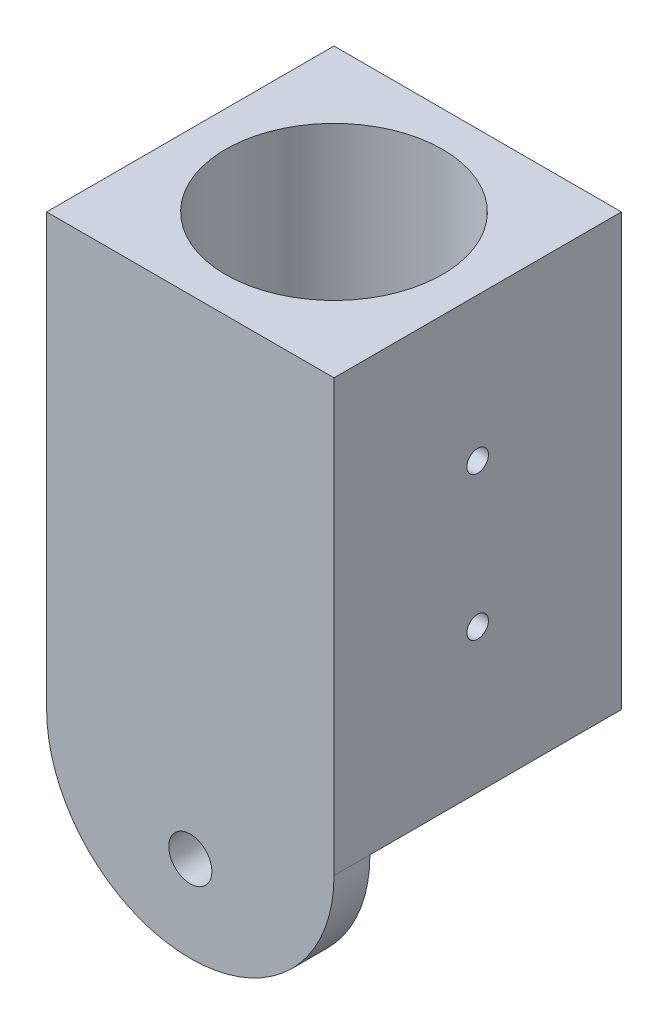
ISO-10303-21;
HEADER;
FILE_DESCRIPTION(('STEP AP214'),'2;1');
FILE_NAME('part.step','',(''),(''),'','','');
FILE_SCHEMA(('AUTOMOTIVE_DESIGN { 1 0 10303 214 1 1 1 1 }'));
ENDSEC;
DATA;
#1=APPLICATION_CONTEXT('core data for automotive mechanical design processes');
#2=APPLICATION_PROTOCOL_DEFINITION('international standard','automotive_design',2000,#1);
#3=PRODUCT_CONTEXT('',#1,'mechanical');
#4=PRODUCT('Part','Part','',(#3));
#5=PRODUCT_RELATED_PRODUCT_CATEGORY('part','',(#4));
#6=PRODUCT_DEFINITION_FORMATION('','',#4);
#7=PRODUCT_DEFINITION_CONTEXT('part definition',#1,'design');
#8=PRODUCT_DEFINITION('design','',#6,#7);
#9=PRODUCT_DEFINITION_SHAPE('','',#8);
#10=(LENGTH_UNIT() NAMED_UNIT(*) SI_UNIT(.MILLI.,.METRE.));
#11=(NAMED_UNIT(*) PLANE_ANGLE_UNIT() SI_UNIT($,.RADIAN.));
#12=(NAMED_UNIT(*) SI_UNIT($,.STERADIAN.) SOLID_ANGLE_UNIT());
#13=UNCERTAINTY_MEASURE_WITH_UNIT(LENGTH_MEASURE(1.E-05),#10,'distance_accuracy_value','');
#14=(GEOMETRIC_REPRESENTATION_CONTEXT(3) GLOBAL_UNCERTAINTY_ASSIGNED_CONTEXT((#13)) GLOBAL_UNIT_ASSIGNED_CONTEXT((#10,
#11,#12)) REPRESENTATION_CONTEXT('',''));
#15=CARTESIAN_POINT('',(0.,0.,0.));
#16=DIRECTION('',(0.,0.,1.));
#17=DIRECTION('',(1.,0.,0.));
#18=AXIS2_PLACEMENT_3D('',#15,#16,#17);
#19=CARTESIAN_POINT('',(0.,0.,0.));
#20=DIRECTION('',(0.,1.,0.));
#21=DIRECTION('',(0.,0.,1.));
#22=AXIS2_PLACEMENT_3D('',#19,#20,#21);
#23=PLANE('',#22);
#24=DIRECTION('',(-1.,0.,0.));
#25=VECTOR('',#24,1.);
#26=CARTESIAN_POINT('',(-20.,0.,15.));
#27=LINE('',#26,#25);
#28=CARTESIAN_POINT('',(20.,0.,15.));
#29=VERTEX_POINT('',#28);
#30=CARTESIAN_POINT('',(-20.,0.,15.));
#31=VERTEX_POINT('',#30);
#32=EDGE_CURVE('E106',#29,#31,#27,.T.);
#33=ORIENTED_EDGE('',*,*,#32,.T.);
#34=DIRECTION('',(0.,0.,1.));
#35=VECTOR('',#34,1.);
#36=CARTESIAN_POINT('',(-20.,0.,-20.));
#37=LINE('',#36,#35);
#38=CARTESIAN_POINT('',(-20.,0.,-20.));
#39=VERTEX_POINT('',#38);
#40=EDGE_CURVE('E121',#39,#31,#37,.T.);
#41=ORIENTED_EDGE('',*,*,#40,.F.);
#42=DIRECTION('',(-1.,0.,0.));
#43=VECTOR('',#42,1.);
#44=CARTESIAN_POINT('',(-20.,0.,-20.));
#45=LINE('',#44,#43);
#46=CARTESIAN_POINT('',(20.,0.,-20.));
#47=VERTEX_POINT('',#46);
#48=EDGE_CURVE('E74',#47,#39,#45,.T.);
#49=ORIENTED_EDGE('',*,*,#48,.F.);
#50=DIRECTION('',(0.,0.,-1.));
#51=VECTOR('',#50,1.);
#52=CARTESIAN_POINT('',(20.,0.,-20.));
#53=LINE('',#52,#51);
#54=EDGE_CURVE('E114',#29,#47,#53,.T.);
#55=ORIENTED_EDGE('',*,*,#54,.F.);
#56=EDGE_LOOP('',(#33,#41,#49,#55));
#57=FACE_BOUND('',#56,.T.);
#58=ADVANCED_FACE('F36',(#57),#23,.F.);
#59=CARTESIAN_POINT('',(20.,60.,-20.));
#60=DIRECTION('',(-1.,0.,0.));
#61=DIRECTION('',(0.,0.,1.));
#62=AXIS2_PLACEMENT_3D('',#59,#60,#61);
#63=PLANE('',#62);
#64=CARTESIAN_POINT('',(20.,40.,0.));
#65=DIRECTION('',(1.,0.,0.));
#66=DIRECTION('',(0.,0.,-1.));
#67=AXIS2_PLACEMENT_3D('',#64,#65,#66);
#68=CIRCLE('',#67,1.5);
#69=CARTESIAN_POINT('',(20.,40.,-1.5));
#70=VERTEX_POINT('',#69);
#71=EDGE_CURVE('E248',#70,#70,#68,.T.);
#72=ORIENTED_EDGE('',*,*,#71,.F.);
#73=EDGE_LOOP('',(#72));
#74=FACE_BOUND('',#73,.T.);
#75=CARTESIAN_POINT('',(20.,20.,0.));
#76=DIRECTION('',(1.,0.,0.));
#77=DIRECTION('',(0.,0.,-1.));
#78=AXIS2_PLACEMENT_3D('',#75,#76,#77);
#79=CIRCLE('',#78,1.5);
#80=CARTESIAN_POINT('',(20.,20.,-1.5));
#81=VERTEX_POINT('',#80);
#82=EDGE_CURVE('E241',#81,#81,#79,.T.);
#83=ORIENTED_EDGE('',*,*,#82,.F.);
#84=EDGE_LOOP('',(#83));
#85=FACE_BOUND('',#84,.T.);
#86=CARTESIAN_POINT('',(20.,0.,20.));
#87=VERTEX_POINT('',#86);
#88=EDGE_CURVE('E100',#87,#29,#53,.T.);
#89=ORIENTED_EDGE('',*,*,#88,.T.);
#90=ORIENTED_EDGE('',*,*,#54,.T.);
#91=DIRECTION('',(0.,-1.,0.));
#92=VECTOR('',#91,1.);
#93=CARTESIAN_POINT('',(20.,60.,-20.));
#94=LINE('',#93,#92);
#95=CARTESIAN_POINT('',(20.,60.,-20.));
#96=VERTEX_POINT('',#95);
#97=EDGE_CURVE('E11',#96,#47,#94,.T.);
#98=ORIENTED_EDGE('',*,*,#97,.F.);
#99=DIRECTION('',(0.,0.,-1.));
#100=VECTOR('',#99,1.);
#101=CARTESIAN_POINT('',(20.,60.,-20.));
#102=LINE('',#101,#100);
#103=CARTESIAN_POINT('',(20.,60.,20.));
#104=VERTEX_POINT('',#103);
#105=EDGE_CURVE('E127',#104,#96,#102,.T.);
#106=ORIENTED_EDGE('',*,*,#105,.F.);
#107=DIRECTION('',(0.,-1.,0.));
#108=VECTOR('',#107,1.);
#109=CARTESIAN_POINT('',(20.,60.,20.));
#110=LINE('',#109,#108);
#111=EDGE_CURVE('E120',#104,#87,#110,.T.);
#112=ORIENTED_EDGE('',*,*,#111,.T.);
#113=EDGE_LOOP('',(#89,#90,#98,#106,#112));
#114=FACE_BOUND('',#113,.T.);
#115=ADVANCED_FACE('F38',(#74,#85,#114),#63,.F.);
#116=CARTESIAN_POINT('',(-20.,60.,-20.));
#117=DIRECTION('',(0.,0.,1.));
#118=DIRECTION('',(1.,0.,0.));
#119=AXIS2_PLACEMENT_3D('',#116,#117,#118);
#120=PLANE('',#119);
#121=ORIENTED_EDGE('',*,*,#48,.T.);
#122=DIRECTION('',(0.,-1.,0.));
#123=VECTOR('',#122,1.);
#124=CARTESIAN_POINT('',(-20.,60.,-20.));
#125=LINE('',#124,#123);
#126=CARTESIAN_POINT('',(-20.,60.,-20.));
#127=VERTEX_POINT('',#126);
#128=EDGE_CURVE('E51',#127,#39,#125,.T.);
#129=ORIENTED_EDGE('',*,*,#128,.F.);
#130=DIRECTION('',(-1.,0.,0.));
#131=VECTOR('',#130,1.);
#132=CARTESIAN_POINT('',(-20.,60.,-20.));
#133=LINE('',#132,#131);
#134=EDGE_CURVE('E86',#96,#127,#133,.T.);
#135=ORIENTED_EDGE('',*,*,#134,.F.);
#136=ORIENTED_EDGE('',*,*,#97,.T.);
#137=EDGE_LOOP('',(#121,#129,#135,#136));
#138=FACE_BOUND('',#137,.T.);
#139=ADVANCED_FACE('F180',(#138),#120,.F.);
#140=CARTESIAN_POINT('',(-20.,60.,-20.));
#141=DIRECTION('',(1.,0.,0.));
#142=DIRECTION('',(0.,0.,-1.));
#143=AXIS2_PLACEMENT_3D('',#140,#141,#142);
#144=PLANE('',#143);
#145=CARTESIAN_POINT('',(-20.,40.,0.));
#146=DIRECTION('',(1.,0.,0.));
#147=DIRECTION('',(0.,0.,-1.));
#148=AXIS2_PLACEMENT_3D('',#145,#146,#147);
#149=CIRCLE('',#148,1.5);
#150=CARTESIAN_POINT('',(-20.,40.,-1.5));
#151=VERTEX_POINT('',#150);
#152=EDGE_CURVE('E238',#151,#151,#149,.T.);
#153=ORIENTED_EDGE('',*,*,#152,.T.);
#154=EDGE_LOOP('',(#153));
#155=FACE_BOUND('',#154,.T.);
#156=CARTESIAN_POINT('',(-20.,20.,0.));
#157=DIRECTION('',(1.,0.,0.));
#158=DIRECTION('',(0.,0.,-1.));
#159=AXIS2_PLACEMENT_3D('',#156,#157,#158);
#160=CIRCLE('',#159,1.5);
#161=CARTESIAN_POINT('',(-20.,20.,-1.5));
#162=VERTEX_POINT('',#161);
#163=EDGE_CURVE('E140',#162,#162,#160,.T.);
#164=ORIENTED_EDGE('',*,*,#163,.T.);
#165=EDGE_LOOP('',(#164));
#166=FACE_BOUND('',#165,.T.);
#167=ORIENTED_EDGE('',*,*,#40,.T.);
#168=DIRECTION('',(0.,0.,1.));
#169=VECTOR('',#168,1.);
#170=CARTESIAN_POINT('',(-20.,0.,15.));
#171=LINE('',#170,#169);
#172=CARTESIAN_POINT('',(-20.,0.,20.));
#173=VERTEX_POINT('',#172);
#174=EDGE_CURVE('E103',#31,#173,#171,.T.);
#175=ORIENTED_EDGE('',*,*,#174,.T.);
#176=DIRECTION('',(0.,-1.,0.));
#177=VECTOR('',#176,1.);
#178=CARTESIAN_POINT('',(-20.,60.,20.));
#179=LINE('',#178,#177);
#180=CARTESIAN_POINT('',(-20.,60.,20.));
#181=VERTEX_POINT('',#180);
#182=EDGE_CURVE('E129',#181,#173,#179,.T.);
#183=ORIENTED_EDGE('',*,*,#182,.F.);
#184=DIRECTION('',(0.,0.,1.));
#185=VECTOR('',#184,1.);
#186=CARTESIAN_POINT('',(-20.,60.,-20.));
#187=LINE('',#186,#185);
#188=EDGE_CURVE('E271',#127,#181,#187,.T.);
#189=ORIENTED_EDGE('',*,*,#188,.F.);
#190=ORIENTED_EDGE('',*,*,#128,.T.);
#191=EDGE_LOOP('',(#167,#175,#183,#189,#190));
#192=FACE_BOUND('',#191,.T.);
#193=ADVANCED_FACE('F186',(#155,#166,#192),#144,.F.);
#194=CARTESIAN_POINT('',(-20.,60.,20.));
#195=DIRECTION('',(0.,0.,-1.));
#196=DIRECTION('',(-1.,0.,0.));
#197=AXIS2_PLACEMENT_3D('',#194,#195,#196);
#198=PLANE('',#197);
#199=ORIENTED_EDGE('',*,*,#182,.T.);
#200=CARTESIAN_POINT('',(0.,0.,20.));
#201=DIRECTION('',(0.,0.,1.));
#202=DIRECTION('',(1.,0.,0.));
#203=AXIS2_PLACEMENT_3D('',#200,#201,#202);
#204=CIRCLE('',#203,20.);
#205=EDGE_CURVE('E81',#173,#87,#204,.T.);
#206=ORIENTED_EDGE('',*,*,#205,.T.);
#207=ORIENTED_EDGE('',*,*,#111,.F.);
#208=DIRECTION('',(1.,0.,0.));
#209=VECTOR('',#208,1.);
#210=CARTESIAN_POINT('',(-20.,60.,20.));
#211=LINE('',#210,#209);
#212=EDGE_CURVE('E60',#181,#104,#211,.T.);
#213=ORIENTED_EDGE('',*,*,#212,.F.);
#214=EDGE_LOOP('',(#199,#206,#207,#213));
#215=FACE_BOUND('',#214,.T.);
#216=CARTESIAN_POINT('',(0.,-8.,20.));
#217=DIRECTION('',(0.,0.,1.));
#218=DIRECTION('',(1.,0.,0.));
#219=AXIS2_PLACEMENT_3D('',#216,#217,#218);
#220=CIRCLE('',#219,3.);
#221=CARTESIAN_POINT('',(3.,-8.,20.));
#222=VERTEX_POINT('',#221);
#223=EDGE_CURVE('E261',#222,#222,#220,.T.);
#224=ORIENTED_EDGE('',*,*,#223,.F.);
#225=EDGE_LOOP('',(#224));
#226=FACE_BOUND('',#225,.T.);
#227=ADVANCED_FACE('F183',(#215,#226),#198,.F.);
#228=CARTESIAN_POINT('',(0.,60.,0.));
#229=DIRECTION('',(0.,1.,0.));
#230=DIRECTION('',(0.,0.,1.));
#231=AXIS2_PLACEMENT_3D('',#228,#229,#230);
#232=PLANE('',#231);
#233=CARTESIAN_POINT('',(0.,60.,0.));
#234=DIRECTION('',(0.,1.,0.));
#235=DIRECTION('',(0.,0.,1.));
#236=AXIS2_PLACEMENT_3D('',#233,#234,#235);
#237=CIRCLE('',#236,15.1);
#238=CARTESIAN_POINT('',(0.,60.,15.1));
#239=VERTEX_POINT('',#238);
#240=EDGE_CURVE('E266',#239,#239,#237,.T.);
#241=ORIENTED_EDGE('',*,*,#240,.F.);
#242=EDGE_LOOP('',(#241));
#243=FACE_BOUND('',#242,.T.);
#244=ORIENTED_EDGE('',*,*,#105,.T.);
#245=ORIENTED_EDGE('',*,*,#134,.T.);
#246=ORIENTED_EDGE('',*,*,#188,.T.);
#247=ORIENTED_EDGE('',*,*,#212,.T.);
#248=EDGE_LOOP('',(#244,#245,#246,#247));
#249=FACE_BOUND('',#248,.T.);
#250=ADVANCED_FACE('F172',(#243,#249),#232,.T.);
#251=CARTESIAN_POINT('',(0.,9.99999999999999,0.));
#252=DIRECTION('',(0.,1.,0.));
#253=DIRECTION('',(0.,0.,1.));
#254=AXIS2_PLACEMENT_3D('',#251,#252,#253);
#255=CYLINDRICAL_SURFACE('',#254,15.1);
#256=CARTESIAN_POINT('',(-15.0253119767944,40.,-1.5));
#257=CARTESIAN_POINT('',(-15.025312956074,39.9159676620919,-1.49999635854613));
#258=CARTESIAN_POINT('',(-15.0260245276725,39.8318796909114,-1.49291478510042));
#259=CARTESIAN_POINT('',(-15.028793551497,39.6660349131521,-1.46477185820528));
#260=CARTESIAN_POINT('',(-15.03085248871,39.5842807826705,-1.44369507968879));
#261=CARTESIAN_POINT('',(-15.0360807748948,39.4255293978987,-1.38818135253405));
#262=CARTESIAN_POINT('',(-15.0392494524589,39.3485293004147,-1.35375248074173));
#263=CARTESIAN_POINT('',(-15.0463393621317,39.201417488061,-1.27252733745513));
#264=CARTESIAN_POINT('',(-15.05026044424,39.1313044043924,-1.22573353035035));
#265=CARTESIAN_POINT('',(-15.0584291270942,38.9996884271419,-1.12092628167147));
#266=CARTESIAN_POINT('',(-15.0626777301768,38.9382137328839,-1.06287750232365));
#267=CARTESIAN_POINT('',(-15.0710136412484,38.8258623723675,-0.937283575420634));
#268=CARTESIAN_POINT('',(-15.0751009418651,38.7749861900552,-0.869737994461096));
#269=CARTESIAN_POINT('',(-15.0826635983521,38.6851787557144,-0.72689531541232));
#270=CARTESIAN_POINT('',(-15.0861376707466,38.6462724329321,-0.651582470180894));
#271=CARTESIAN_POINT('',(-15.0920715347339,38.5816686124249,-0.495452469131725));
#272=CARTESIAN_POINT('',(-15.0945313507482,38.5559707966588,-0.414635445899537));
#273=CARTESIAN_POINT('',(-15.0981525138302,38.5185960854439,-0.250075883600477));
#274=CARTESIAN_POINT('',(-15.0993181456551,38.5068729134921,-0.166343950618246));
#275=CARTESIAN_POINT('',(-15.100234174601,38.4976370858915,0.00190655759439075));
#276=CARTESIAN_POINT('',(-15.0999846079687,38.5001240662856,0.086425112622109));
#277=CARTESIAN_POINT('',(-15.0981018679929,38.5192003682383,0.253535560434281));
#278=CARTESIAN_POINT('',(-15.0964735769364,38.5357399280402,0.336133196401712));
#279=CARTESIAN_POINT('',(-15.0920219994832,38.5823743756564,0.497374352123942));
#280=CARTESIAN_POINT('',(-15.0891986977396,38.612469437557,0.576017821082989));
#281=CARTESIAN_POINT('',(-15.0826661343107,38.685415201237,0.727275160741129));
#282=CARTESIAN_POINT('',(-15.0789553445811,38.7282879348315,0.799878337650498));
#283=CARTESIAN_POINT('',(-15.0710642123586,38.8255560438999,0.936877465459625));
#284=CARTESIAN_POINT('',(-15.0668838562791,38.879951752825,1.00127317876582));
#285=CARTESIAN_POINT('',(-15.0585014337633,38.9990016032106,1.12032085957513));
#286=CARTESIAN_POINT('',(-15.054299351531,39.0636990304483,1.17492954862421));
#287=CARTESIAN_POINT('',(-15.0463651004589,39.201365684078,1.27251801061355));
#288=CARTESIAN_POINT('',(-15.0426329322861,39.2743349222103,1.31549776704826));
#289=CARTESIAN_POINT('',(-15.0360607178808,39.426507005085,1.38860805601259));
#290=CARTESIAN_POINT('',(-15.0332208560381,39.505711134007,1.41873593323833));
#291=CARTESIAN_POINT('',(-15.0287585753405,39.6680883326636,1.46525308871646));
#292=CARTESIAN_POINT('',(-15.0271361198954,39.7512612830321,1.48164277988374));
#293=CARTESIAN_POINT('',(-15.0252986591232,39.9188352636901,1.50016268663854));
#294=CARTESIAN_POINT('',(-15.0250776785925,40.0032295405848,1.50235344042828));
#295=CARTESIAN_POINT('',(-15.0260524182927,40.1711840102969,1.49257225368717));
#296=CARTESIAN_POINT('',(-15.0272481196383,40.2547442142182,1.48060050195128));
#297=CARTESIAN_POINT('',(-15.0309160596127,40.4184822238691,1.44288477969783));
#298=CARTESIAN_POINT('',(-15.0333856461404,40.4986666838852,1.41716941799686));
#299=CARTESIAN_POINT('',(-15.0393209391003,40.6535838762131,1.35272564260952));
#300=CARTESIAN_POINT('',(-15.0427866680578,40.7283164851969,1.31399693465547));
#301=CARTESIAN_POINT('',(-15.0503382064572,40.8704845722181,1.2244741127262));
#302=CARTESIAN_POINT('',(-15.0544260614167,40.9378946728515,1.17363987299589));
#303=CARTESIAN_POINT('',(-15.0627545443571,41.0632469104025,1.06140651663175));
#304=CARTESIAN_POINT('',(-15.0669951760684,41.1211888159303,1.00000714187558));
#305=CARTESIAN_POINT('',(-15.0751694218504,41.2261685790411,0.868123835144984));
#306=CARTESIAN_POINT('',(-15.0791018911967,41.2731669510903,0.797608391658785));
#307=CARTESIAN_POINT('',(-15.0862000664518,41.3546538558809,0.649650329668302));
#308=CARTESIAN_POINT('',(-15.0893657827459,41.389142558064,0.572207805008102));
#309=CARTESIAN_POINT('',(-15.0945685839412,41.4445641728181,0.41273188161015));
#310=CARTESIAN_POINT('',(-15.0966076555916,41.4655209589395,0.330706846940062));
#311=CARTESIAN_POINT('',(-15.099335565752,41.4933617737986,0.16428100536423));
#312=CARTESIAN_POINT('',(-15.1000244416734,41.5002461924544,0.0798802643504153));
#313=CARTESIAN_POINT('',(-15.0999743264919,41.4997414076765,-0.0885132586038627));
#314=CARTESIAN_POINT('',(-15.0992414683536,41.4924135122405,-0.172506232884097));
#315=CARTESIAN_POINT('',(-15.096442335095,41.4638206390987,-0.338061727779913));
#316=CARTESIAN_POINT('',(-15.0943760588904,41.4425556500599,-0.41962424641913));
#317=CARTESIAN_POINT('',(-15.0891416171645,41.3867091488097,-0.5780032882442));
#318=CARTESIAN_POINT('',(-15.0859735976019,41.3521294004693,-0.654820438508597));
#319=CARTESIAN_POINT('',(-15.078888864656,41.2706415319087,-0.801569837575121));
#320=CARTESIAN_POINT('',(-15.0749721559724,41.2237334890742,-0.871502129590261));
#321=CARTESIAN_POINT('',(-15.0668086636542,41.1186906745015,-1.00281085394436));
#322=CARTESIAN_POINT('',(-15.0625605816352,41.0605102643219,-1.06415069694839));
#323=CARTESIAN_POINT('',(-15.0542241088092,40.9346639349868,-1.17622425255196));
#324=CARTESIAN_POINT('',(-15.050135756584,40.8669957419999,-1.22695541540431));
#325=CARTESIAN_POINT('',(-15.042570630608,40.7239089433625,-1.31647186691678));
#326=CARTESIAN_POINT('',(-15.0390954200226,40.6484712829841,-1.35522680653065));
#327=CARTESIAN_POINT('',(-15.0331686996374,40.4921729527212,-1.41946790711139));
#328=CARTESIAN_POINT('',(-15.0307160348248,40.4113185218565,-1.444969046934));
#329=CARTESIAN_POINT('',(-15.0277311589647,40.2750045514355,-1.47561362318629));
#330=CARTESIAN_POINT('',(-15.0268282506956,40.2204167180033,-1.48474603116335));
#331=CARTESIAN_POINT('',(-15.0256183386627,40.1105606166398,-1.49694040505908));
#332=CARTESIAN_POINT('',(-15.0253113324391,40.0552923515182,-1.50000239603648));
#333=CARTESIAN_POINT('',(-15.0253119767944,40.,-1.5));
#334=B_SPLINE_CURVE_WITH_KNOTS('',3,(#256,#257,#258,#259,#260,#261,#262,#263,#264,#265,#266,
#267,#268,#269,#270,#271,#272,#273,#274,#275,#276,#277,#278,#279,#280,#281,#282,#283,#284,#285,
#286,#287,#288,#289,#290,#291,#292,#293,#294,#295,#296,#297,#298,#299,#300,#301,#302,#303,#304,
#305,#306,#307,#308,#309,#310,#311,#312,#313,#314,#315,#316,#317,#318,#319,#320,#321,#322,#323,
#324,#325,#326,#327,#328,#329,#330,#331,#332,#333),.UNSPECIFIED.,.T.,.F.,(4,2,2,2,2,2,2,2,2,2,2,
2,2,2,2,2,2,2,2,2,2,2,2,2,2,2,2,2,2,2,2,2,2,2,2,2,2,2,4),(0.,0.251895097196481,0.50406828696038,
0.75608917138904,1.00805986471088,1.26083488254587,1.51362143998953,1.76693095868192,
2.02023437776912,2.27269664114698,2.52515243837155,2.77671796950038,3.02828673144791,
3.28029179364622,3.53230414935095,3.78540479946109,4.03850580880848,4.29165908560718,
4.54480475335872,4.79687040216312,5.04893269081456,5.30047231646476,5.552017630503,
5.80440863162634,6.05680579992193,6.31010000309801,6.56339077531053,6.81623345189484,
7.06906912260185,7.32081655553195,7.57256419316888,7.82427849203737,8.07599121091296,
8.32874517901134,8.58155982571251,8.83500997565595,9.08817306120622,9.25391794111063,
9.41966213681694),.UNSPECIFIED.);
#335=CARTESIAN_POINT('',(-15.0253119767944,40.,-1.5));
#336=VERTEX_POINT('',#335);
#337=EDGE_CURVE('E40',#336,#336,#334,.T.);
#338=ORIENTED_EDGE('',*,*,#337,.T.);
#339=EDGE_LOOP('',(#338));
#340=FACE_BOUND('',#339,.T.);
#341=CARTESIAN_POINT('',(15.0253119767944,40.,-1.5));
#342=CARTESIAN_POINT('',(15.025312956074,40.0840323379081,-1.49999635854613));
#343=CARTESIAN_POINT('',(15.0260245276725,40.1681203090886,-1.49291478510043));
#344=CARTESIAN_POINT('',(15.028793551497,40.3339650868479,-1.46477185820529));
#345=CARTESIAN_POINT('',(15.03085248871,40.4157192173295,-1.44369507968879));
#346=CARTESIAN_POINT('',(15.0360807748948,40.5744706021013,-1.38818135253405));
#347=CARTESIAN_POINT('',(15.0392494524589,40.6514706995853,-1.35375248074173));
#348=CARTESIAN_POINT('',(15.0463393621317,40.798582511939,-1.27252733745513));
#349=CARTESIAN_POINT('',(15.05026044424,40.8686955956076,-1.22573353035035));
#350=CARTESIAN_POINT('',(15.0584291270942,41.0003115728581,-1.12092628167147));
#351=CARTESIAN_POINT('',(15.0626777301768,41.0617862671161,-1.06287750232365));
#352=CARTESIAN_POINT('',(15.0710136412484,41.1741376276325,-0.937283575420637));
#353=CARTESIAN_POINT('',(15.0751009418651,41.2250138099448,-0.869737994461099));
#354=CARTESIAN_POINT('',(15.0826635983521,41.3148212442856,-0.726895315412323));
#355=CARTESIAN_POINT('',(15.0861376707466,41.3537275670679,-0.651582470180896));
#356=CARTESIAN_POINT('',(15.0920715347339,41.4183313875751,-0.495452469131727));
#357=CARTESIAN_POINT('',(15.0945313507482,41.4440292033412,-0.414635445899539));
#358=CARTESIAN_POINT('',(15.0981525138302,41.4814039145561,-0.250075883600479));
#359=CARTESIAN_POINT('',(15.0993181456551,41.4931270865079,-0.166343950618249));
#360=CARTESIAN_POINT('',(15.100234174601,41.5023629141085,0.00190655759438839));
#361=CARTESIAN_POINT('',(15.0999846079687,41.4998759337144,0.0864251126221066));
#362=CARTESIAN_POINT('',(15.0981018679929,41.4807996317617,0.253535560434278));
#363=CARTESIAN_POINT('',(15.0964735769364,41.4642600719598,0.33613319640171));
#364=CARTESIAN_POINT('',(15.0920219994832,41.4176256243436,0.497374352123939));
#365=CARTESIAN_POINT('',(15.0891986977396,41.387530562443,0.576017821082987));
#366=CARTESIAN_POINT('',(15.0826661343107,41.314584798763,0.727275160741127));
#367=CARTESIAN_POINT('',(15.0789553445811,41.2717120651685,0.799878337650496));
#368=CARTESIAN_POINT('',(15.0710642123586,41.1744439561001,0.936877465459623));
#369=CARTESIAN_POINT('',(15.0668838562791,41.120048247175,1.00127317876582));
#370=CARTESIAN_POINT('',(15.0585014337633,41.0009983967895,1.12032085957512));
#371=CARTESIAN_POINT('',(15.054299351531,40.9363009695517,1.1749295486242));
#372=CARTESIAN_POINT('',(15.0463651004589,40.798634315922,1.27251801061355));
#373=CARTESIAN_POINT('',(15.0426329322861,40.7256650777897,1.31549776704826));
#374=CARTESIAN_POINT('',(15.0360607178808,40.573492994915,1.38860805601259));
#375=CARTESIAN_POINT('',(15.0332208560381,40.494288865993,1.41873593323833));
#376=CARTESIAN_POINT('',(15.0287585753405,40.3319116673364,1.46525308871646));
#377=CARTESIAN_POINT('',(15.0271361198954,40.2487387169679,1.48164277988374));
#378=CARTESIAN_POINT('',(15.0252986591232,40.0811647363099,1.50016268663854));
#379=CARTESIAN_POINT('',(15.0250776785925,39.9967704594153,1.50235344042828));
#380=CARTESIAN_POINT('',(15.0260524182927,39.8288159897031,1.49257225368717));
#381=CARTESIAN_POINT('',(15.0272481196383,39.7452557857818,1.48060050195127));
#382=CARTESIAN_POINT('',(15.0309160596127,39.5815177761309,1.44288477969783));
#383=CARTESIAN_POINT('',(15.0333856461404,39.5013333161148,1.41716941799686));
#384=CARTESIAN_POINT('',(15.0393209391003,39.3464161237869,1.35272564260952));
#385=CARTESIAN_POINT('',(15.0427866680578,39.2716835148031,1.31399693465547));
#386=CARTESIAN_POINT('',(15.0503382064572,39.1295154277819,1.2244741127262));
#387=CARTESIAN_POINT('',(15.0544260614167,39.0621053271485,1.17363987299589));
#388=CARTESIAN_POINT('',(15.0627545443571,38.9367530895975,1.06140651663175));
#389=CARTESIAN_POINT('',(15.0669951760684,38.8788111840697,1.00000714187558));
#390=CARTESIAN_POINT('',(15.0751694218504,38.7738314209589,0.868123835144981));
#391=CARTESIAN_POINT('',(15.0791018911967,38.7268330489097,0.797608391658782));
#392=CARTESIAN_POINT('',(15.0862000664518,38.6453461441191,0.6496503296683));
#393=CARTESIAN_POINT('',(15.0893657827459,38.610857441936,0.572207805008099));
#394=CARTESIAN_POINT('',(15.0945685839412,38.5554358271819,0.412731881610147));
#395=CARTESIAN_POINT('',(15.0966076555916,38.5344790410605,0.330706846940059));
#396=CARTESIAN_POINT('',(15.099335565752,38.5066382262014,0.164281005364227));
#397=CARTESIAN_POINT('',(15.1000244416734,38.4997538075456,0.0798802643504121));
#398=CARTESIAN_POINT('',(15.0999743264919,38.5002585923235,-0.0885132586038662));
#399=CARTESIAN_POINT('',(15.0992414683536,38.5075864877595,-0.172506232884101));
#400=CARTESIAN_POINT('',(15.096442335095,38.5361793609014,-0.338061727779916));
#401=CARTESIAN_POINT('',(15.0943760588904,38.5574443499401,-0.419624246419134));
#402=CARTESIAN_POINT('',(15.0891416171645,38.6132908511903,-0.578003288244203));
#403=CARTESIAN_POINT('',(15.0859735976019,38.6478705995307,-0.6548204385086));
#404=CARTESIAN_POINT('',(15.078888864656,38.7293584680913,-0.801569837575124));
#405=CARTESIAN_POINT('',(15.0749721559724,38.7762665109258,-0.871502129590265));
#406=CARTESIAN_POINT('',(15.0668086636542,38.8813093254985,-1.00281085394436));
#407=CARTESIAN_POINT('',(15.0625605816352,38.9394897356781,-1.06415069694839));
#408=CARTESIAN_POINT('',(15.0542241088092,39.0653360650132,-1.17622425255196));
#409=CARTESIAN_POINT('',(15.050135756584,39.1330042580001,-1.22695541540431));
#410=CARTESIAN_POINT('',(15.042570630608,39.2760910566375,-1.31647186691678));
#411=CARTESIAN_POINT('',(15.0390954200226,39.3515287170159,-1.35522680653066));
#412=CARTESIAN_POINT('',(15.0331686996374,39.5078270472788,-1.41946790711139));
#413=CARTESIAN_POINT('',(15.0307160348248,39.5886814781435,-1.444969046934));
#414=CARTESIAN_POINT('',(15.0277311589647,39.7249954485645,-1.47561362318629));
#415=CARTESIAN_POINT('',(15.0268282506956,39.7795832819967,-1.48474603116336));
#416=CARTESIAN_POINT('',(15.0256183386627,39.8894393833602,-1.49694040505908));
#417=CARTESIAN_POINT('',(15.0253113324391,39.9447076484818,-1.50000239603649));
#418=CARTESIAN_POINT('',(15.0253119767944,40.,-1.5));
#419=B_SPLINE_CURVE_WITH_KNOTS('',3,(#341,#342,#343,#344,#345,#346,#347,#348,#349,#350,#351,
#352,#353,#354,#355,#356,#357,#358,#359,#360,#361,#362,#363,#364,#365,#366,#367,#368,#369,#370,
#371,#372,#373,#374,#375,#376,#377,#378,#379,#380,#381,#382,#383,#384,#385,#386,#387,#388,#389,
#390,#391,#392,#393,#394,#395,#396,#397,#398,#399,#400,#401,#402,#403,#404,#405,#406,#407,#408,
#409,#410,#411,#412,#413,#414,#415,#416,#417,#418),.UNSPECIFIED.,.T.,.F.,(4,2,2,2,2,2,2,2,2,2,2,
2,2,2,2,2,2,2,2,2,2,2,2,2,2,2,2,2,2,2,2,2,2,2,2,2,2,2,4),(0.,0.251895097196481,0.50406828696038,
0.75608917138904,1.00805986471088,1.26083488254587,1.51362143998953,1.76693095868192,
2.02023437776912,2.27269664114698,2.52515243837155,2.77671796950038,3.02828673144791,
3.28029179364622,3.53230414935095,3.78540479946109,4.03850580880848,4.29165908560718,
4.54480475335872,4.79687040216312,5.04893269081456,5.30047231646476,5.552017630503,
5.80440863162633,6.05680579992193,6.31010000309801,6.56339077531053,6.81623345189484,
7.06906912260185,7.32081655553195,7.57256419316888,7.82427849203737,8.07599121091296,
8.32874517901134,8.58155982571251,8.83500997565596,9.08817306120622,9.25391794111063,
9.41966213681694),.UNSPECIFIED.);
#420=CARTESIAN_POINT('',(15.0253119767944,40.,-1.5));
#421=VERTEX_POINT('',#420);
#422=EDGE_CURVE('E242',#421,#421,#419,.T.);
#423=ORIENTED_EDGE('',*,*,#422,.T.);
#424=EDGE_LOOP('',(#423));
#425=FACE_BOUND('',#424,.T.);
#426=CARTESIAN_POINT('',(-15.0253119767944,20.,-1.5));
#427=CARTESIAN_POINT('',(-15.025312956074,19.9159676620919,-1.49999635854613));
#428=CARTESIAN_POINT('',(-15.0260245276725,19.8318796909114,-1.49291478510042));
#429=CARTESIAN_POINT('',(-15.028793551497,19.6660349131521,-1.46477185820528));
#430=CARTESIAN_POINT('',(-15.03085248871,19.5842807826705,-1.44369507968879));
#431=CARTESIAN_POINT('',(-15.0360807748948,19.4255293978987,-1.38818135253405));
#432=CARTESIAN_POINT('',(-15.0392494524589,19.3485293004147,-1.35375248074173));
#433=CARTESIAN_POINT('',(-15.0463393621317,19.201417488061,-1.27252733745512));
#434=CARTESIAN_POINT('',(-15.05026044424,19.1313044043924,-1.22573353035035));
#435=CARTESIAN_POINT('',(-15.0584291270942,18.9996884271419,-1.12092628167147));
#436=CARTESIAN_POINT('',(-15.0626777301768,18.9382137328839,-1.06287750232365));
#437=CARTESIAN_POINT('',(-15.0710136412484,18.8258623723675,-0.937283575420636));
#438=CARTESIAN_POINT('',(-15.0751009418651,18.7749861900552,-0.869737994461099));
#439=CARTESIAN_POINT('',(-15.0826635983521,18.6851787557144,-0.726895315412322));
#440=CARTESIAN_POINT('',(-15.0861376707466,18.6462724329321,-0.651582470180895));
#441=CARTESIAN_POINT('',(-15.0920715347339,18.5816686124249,-0.495452469131725));
#442=CARTESIAN_POINT('',(-15.0945313507482,18.5559707966588,-0.414635445899537));
#443=CARTESIAN_POINT('',(-15.0981525138302,18.5185960854439,-0.250075883600477));
#444=CARTESIAN_POINT('',(-15.0993181456551,18.5068729134921,-0.166343950618246));
#445=CARTESIAN_POINT('',(-15.100234174601,18.4976370858915,0.0019065575943914));
#446=CARTESIAN_POINT('',(-15.0999846079687,18.5001240662856,0.0864251126221095));
#447=CARTESIAN_POINT('',(-15.0981018679929,18.5192003682383,0.253535560434281));
#448=CARTESIAN_POINT('',(-15.0964735769364,18.5357399280402,0.336133196401712));
#449=CARTESIAN_POINT('',(-15.0920219994832,18.5823743756564,0.497374352123941));
#450=CARTESIAN_POINT('',(-15.0891986977396,18.612469437557,0.576017821082989));
#451=CARTESIAN_POINT('',(-15.0826661343107,18.685415201237,0.72727516074113));
#452=CARTESIAN_POINT('',(-15.0789553445811,18.7282879348315,0.7998783376505));
#453=CARTESIAN_POINT('',(-15.0710642123586,18.8255560438999,0.936877465459628));
#454=CARTESIAN_POINT('',(-15.0668838562791,18.879951752825,1.00127317876582));
#455=CARTESIAN_POINT('',(-15.0585014337633,18.9990016032106,1.12032085957513));
#456=CARTESIAN_POINT('',(-15.054299351531,19.0636990304484,1.17492954862421));
#457=CARTESIAN_POINT('',(-15.0463651004589,19.201365684078,1.27251801061355));
#458=CARTESIAN_POINT('',(-15.0426329322861,19.2743349222103,1.31549776704826));
#459=CARTESIAN_POINT('',(-15.0360607178808,19.426507005085,1.38860805601259));
#460=CARTESIAN_POINT('',(-15.0332208560381,19.505711134007,1.41873593323833));
#461=CARTESIAN_POINT('',(-15.0287585753405,19.6680883326636,1.46525308871646));
#462=CARTESIAN_POINT('',(-15.0271361198954,19.7512612830321,1.48164277988374));
#463=CARTESIAN_POINT('',(-15.0252986591232,19.9188352636901,1.50016268663854));
#464=CARTESIAN_POINT('',(-15.0250776785925,20.0032295405847,1.50235344042828));
#465=CARTESIAN_POINT('',(-15.0260524182927,20.1711840102969,1.49257225368717));
#466=CARTESIAN_POINT('',(-15.0272481196383,20.2547442142182,1.48060050195128));
#467=CARTESIAN_POINT('',(-15.0309160596127,20.4184822238692,1.44288477969783));
#468=CARTESIAN_POINT('',(-15.0333856461404,20.4986666838853,1.41716941799686));
#469=CARTESIAN_POINT('',(-15.0393209391003,20.6535838762131,1.35272564260952));
#470=CARTESIAN_POINT('',(-15.0427866680578,20.7283164851969,1.31399693465547));
#471=CARTESIAN_POINT('',(-15.0503382064572,20.8704845722181,1.2244741127262));
#472=CARTESIAN_POINT('',(-15.0544260614167,20.9378946728515,1.17363987299589));
#473=CARTESIAN_POINT('',(-15.0627545443571,21.0632469104025,1.06140651663175));
#474=CARTESIAN_POINT('',(-15.0669951760684,21.1211888159303,1.00000714187558));
#475=CARTESIAN_POINT('',(-15.0751694218504,21.2261685790411,0.868123835144984));
#476=CARTESIAN_POINT('',(-15.0791018911967,21.2731669510903,0.797608391658784));
#477=CARTESIAN_POINT('',(-15.0862000664518,21.3546538558809,0.6496503296683));
#478=CARTESIAN_POINT('',(-15.0893657827459,21.389142558064,0.572207805008099));
#479=CARTESIAN_POINT('',(-15.0945685839412,21.4445641728181,0.412731881610147));
#480=CARTESIAN_POINT('',(-15.0966076555916,21.4655209589395,0.330706846940058));
#481=CARTESIAN_POINT('',(-15.099335565752,21.4933617737986,0.164281005364226));
#482=CARTESIAN_POINT('',(-15.1000244416734,21.5002461924544,0.0798802643504114));
#483=CARTESIAN_POINT('',(-15.0999743264919,21.4997414076765,-0.0885132586038667));
#484=CARTESIAN_POINT('',(-15.0992414683536,21.4924135122405,-0.172506232884101));
#485=CARTESIAN_POINT('',(-15.096442335095,21.4638206390987,-0.338061727779915));
#486=CARTESIAN_POINT('',(-15.0943760588904,21.4425556500599,-0.419624246419132));
#487=CARTESIAN_POINT('',(-15.0891416171645,21.3867091488097,-0.578003288244201));
#488=CARTESIAN_POINT('',(-15.0859735976019,21.3521294004693,-0.654820438508598));
#489=CARTESIAN_POINT('',(-15.078888864656,21.2706415319087,-0.801569837575122));
#490=CARTESIAN_POINT('',(-15.0749721559724,21.2237334890742,-0.871502129590262));
#491=CARTESIAN_POINT('',(-15.0668086636542,21.1186906745015,-1.00281085394435));
#492=CARTESIAN_POINT('',(-15.0625605816352,21.0605102643219,-1.06415069694839));
#493=CARTESIAN_POINT('',(-15.0542241088092,20.9346639349868,-1.17622425255196));
#494=CARTESIAN_POINT('',(-15.050135756584,20.8669957419999,-1.22695541540431));
#495=CARTESIAN_POINT('',(-15.042570630608,20.7239089433625,-1.31647186691678));
#496=CARTESIAN_POINT('',(-15.0390954200226,20.6484712829841,-1.35522680653065));
#497=CARTESIAN_POINT('',(-15.0331686996374,20.4921729527212,-1.41946790711139));
#498=CARTESIAN_POINT('',(-15.0307160348248,20.4113185218565,-1.444969046934));
#499=CARTESIAN_POINT('',(-15.0277311589647,20.2750045514355,-1.47561362318629));
#500=CARTESIAN_POINT('',(-15.0268282506956,20.2204167180033,-1.48474603116335));
#501=CARTESIAN_POINT('',(-15.0256183386627,20.1105606166398,-1.49694040505908));
#502=CARTESIAN_POINT('',(-15.0253113324391,20.0552923515182,-1.50000239603648));
#503=CARTESIAN_POINT('',(-15.0253119767944,20.,-1.5));
#504=B_SPLINE_CURVE_WITH_KNOTS('',3,(#426,#427,#428,#429,#430,#431,#432,#433,#434,#435,#436,
#437,#438,#439,#440,#441,#442,#443,#444,#445,#446,#447,#448,#449,#450,#451,#452,#453,#454,#455,
#456,#457,#458,#459,#460,#461,#462,#463,#464,#465,#466,#467,#468,#469,#470,#471,#472,#473,#474,
#475,#476,#477,#478,#479,#480,#481,#482,#483,#484,#485,#486,#487,#488,#489,#490,#491,#492,#493,
#494,#495,#496,#497,#498,#499,#500,#501,#502,#503),.UNSPECIFIED.,.T.,.F.,(4,2,2,2,2,2,2,2,2,2,2,
2,2,2,2,2,2,2,2,2,2,2,2,2,2,2,2,2,2,2,2,2,2,2,2,2,2,2,4),(0.,0.251895097196481,0.50406828696038,
0.756089171389044,1.00805986471088,1.26083488254587,1.51362143998953,1.76693095868191,
2.02023437776912,2.27269664114698,2.52515243837155,2.77671796950038,3.02828673144791,
3.28029179364623,3.53230414935095,3.78540479946109,4.03850580880848,4.29165908560718,
4.54480475335871,4.79687040216312,5.04893269081456,5.30047231646477,5.552017630503,
5.80440863162633,6.05680579992193,6.31010000309801,6.56339077531053,6.81623345189484,
7.06906912260185,7.32081655553195,7.57256419316888,7.82427849203737,8.07599121091297,
8.32874517901134,8.58155982571251,8.83500997565597,9.08817306120622,9.25391794111062,
9.41966213681694),.UNSPECIFIED.);
#505=CARTESIAN_POINT('',(-15.0253119767944,20.,-1.5));
#506=VERTEX_POINT('',#505);
#507=EDGE_CURVE('E139',#506,#506,#504,.T.);
#508=ORIENTED_EDGE('',*,*,#507,.T.);
#509=EDGE_LOOP('',(#508));
#510=FACE_BOUND('',#509,.T.);
#511=CARTESIAN_POINT('',(15.0253119767944,20.,-1.5));
#512=CARTESIAN_POINT('',(15.025312956074,20.0840323379081,-1.49999635854613));
#513=CARTESIAN_POINT('',(15.0260245276725,20.1681203090886,-1.49291478510043));
#514=CARTESIAN_POINT('',(15.028793551497,20.3339650868479,-1.46477185820529));
#515=CARTESIAN_POINT('',(15.03085248871,20.4157192173295,-1.44369507968879));
#516=CARTESIAN_POINT('',(15.0360807748948,20.5744706021013,-1.38818135253405));
#517=CARTESIAN_POINT('',(15.0392494524589,20.6514706995853,-1.35375248074173));
#518=CARTESIAN_POINT('',(15.0463393621317,20.798582511939,-1.27252733745513));
#519=CARTESIAN_POINT('',(15.05026044424,20.8686955956076,-1.22573353035035));
#520=CARTESIAN_POINT('',(15.0584291270942,21.0003115728581,-1.12092628167147));
#521=CARTESIAN_POINT('',(15.0626777301768,21.0617862671161,-1.06287750232365));
#522=CARTESIAN_POINT('',(15.0710136412484,21.1741376276325,-0.937283575420639));
#523=CARTESIAN_POINT('',(15.0751009418651,21.2250138099448,-0.869737994461101));
#524=CARTESIAN_POINT('',(15.0826635983521,21.3148212442856,-0.726895315412325));
#525=CARTESIAN_POINT('',(15.0861376707466,21.3537275670679,-0.651582470180898));
#526=CARTESIAN_POINT('',(15.0920715347339,21.4183313875751,-0.495452469131728));
#527=CARTESIAN_POINT('',(15.0945313507482,21.4440292033412,-0.41463544589954));
#528=CARTESIAN_POINT('',(15.0981525138302,21.4814039145561,-0.250075883600479));
#529=CARTESIAN_POINT('',(15.0993181456551,21.4931270865079,-0.166343950618249));
#530=CARTESIAN_POINT('',(15.100234174601,21.5023629141085,0.00190655759438887));
#531=CARTESIAN_POINT('',(15.0999846079687,21.4998759337144,0.0864251126221071));
#532=CARTESIAN_POINT('',(15.0981018679929,21.4807996317617,0.253535560434278));
#533=CARTESIAN_POINT('',(15.0964735769364,21.4642600719598,0.33613319640171));
#534=CARTESIAN_POINT('',(15.0920219994832,21.4176256243436,0.497374352123939));
#535=CARTESIAN_POINT('',(15.0891986977396,21.387530562443,0.576017821082986));
#536=CARTESIAN_POINT('',(15.0826661343107,21.314584798763,0.727275160741128));
#537=CARTESIAN_POINT('',(15.0789553445811,21.2717120651685,0.799878337650499));
#538=CARTESIAN_POINT('',(15.0710642123586,21.1744439561001,0.936877465459627));
#539=CARTESIAN_POINT('',(15.0668838562791,21.120048247175,1.00127317876582));
#540=CARTESIAN_POINT('',(15.0585014337633,21.0009983967894,1.12032085957513));
#541=CARTESIAN_POINT('',(15.054299351531,20.9363009695516,1.17492954862421));
#542=CARTESIAN_POINT('',(15.0463651004589,20.798634315922,1.27251801061355));
#543=CARTESIAN_POINT('',(15.0426329322861,20.7256650777897,1.31549776704826));
#544=CARTESIAN_POINT('',(15.0360607178808,20.573492994915,1.38860805601259));
#545=CARTESIAN_POINT('',(15.0332208560381,20.494288865993,1.41873593323833));
#546=CARTESIAN_POINT('',(15.0287585753405,20.3319116673364,1.46525308871646));
#547=CARTESIAN_POINT('',(15.0271361198954,20.2487387169679,1.48164277988374));
#548=CARTESIAN_POINT('',(15.0252986591232,20.0811647363099,1.50016268663854));
#549=CARTESIAN_POINT('',(15.0250776785925,19.9967704594153,1.50235344042828));
#550=CARTESIAN_POINT('',(15.0260524182927,19.8288159897031,1.49257225368717));
#551=CARTESIAN_POINT('',(15.0272481196383,19.7452557857818,1.48060050195127));
#552=CARTESIAN_POINT('',(15.0309160596127,19.5815177761309,1.44288477969783));
#553=CARTESIAN_POINT('',(15.0333856461404,19.5013333161147,1.41716941799686));
#554=CARTESIAN_POINT('',(15.0393209391003,19.3464161237869,1.35272564260952));
#555=CARTESIAN_POINT('',(15.0427866680578,19.2716835148031,1.31399693465547));
#556=CARTESIAN_POINT('',(15.0503382064572,19.1295154277819,1.22447411272619));
#557=CARTESIAN_POINT('',(15.0544260614167,19.0621053271485,1.17363987299589));
#558=CARTESIAN_POINT('',(15.0627545443571,18.9367530895975,1.06140651663175));
#559=CARTESIAN_POINT('',(15.0669951760684,18.8788111840697,1.00000714187558));
#560=CARTESIAN_POINT('',(15.0751694218504,18.7738314209589,0.868123835144979));
#561=CARTESIAN_POINT('',(15.0791018911967,18.7268330489097,0.797608391658779));
#562=CARTESIAN_POINT('',(15.0862000664518,18.6453461441191,0.649650329668296));
#563=CARTESIAN_POINT('',(15.0893657827459,18.610857441936,0.572207805008095));
#564=CARTESIAN_POINT('',(15.0945685839412,18.5554358271819,0.412731881610144));
#565=CARTESIAN_POINT('',(15.0966076555916,18.5344790410605,0.330706846940056));
#566=CARTESIAN_POINT('',(15.099335565752,18.5066382262014,0.164281005364224));
#567=CARTESIAN_POINT('',(15.1000244416734,18.4997538075456,0.0798802643504086));
#568=CARTESIAN_POINT('',(15.0999743264919,18.5002585923235,-0.0885132586038693));
#569=CARTESIAN_POINT('',(15.0992414683536,18.5075864877595,-0.172506232884103));
#570=CARTESIAN_POINT('',(15.096442335095,18.5361793609013,-0.338061727779918));
#571=CARTESIAN_POINT('',(15.0943760588904,18.5574443499401,-0.419624246419135));
#572=CARTESIAN_POINT('',(15.0891416171645,18.6132908511903,-0.578003288244204));
#573=CARTESIAN_POINT('',(15.0859735976019,18.6478705995307,-0.654820438508601));
#574=CARTESIAN_POINT('',(15.078888864656,18.7293584680913,-0.801569837575125));
#575=CARTESIAN_POINT('',(15.0749721559724,18.7762665109258,-0.871502129590265));
#576=CARTESIAN_POINT('',(15.0668086636542,18.8813093254985,-1.00281085394436));
#577=CARTESIAN_POINT('',(15.0625605816352,18.9394897356781,-1.06415069694839));
#578=CARTESIAN_POINT('',(15.0542241088092,19.0653360650132,-1.17622425255196));
#579=CARTESIAN_POINT('',(15.050135756584,19.1330042580001,-1.22695541540431));
#580=CARTESIAN_POINT('',(15.042570630608,19.2760910566375,-1.31647186691678));
#581=CARTESIAN_POINT('',(15.0390954200226,19.3515287170159,-1.35522680653066));
#582=CARTESIAN_POINT('',(15.0331686996374,19.5078270472788,-1.41946790711139));
#583=CARTESIAN_POINT('',(15.0307160348248,19.5886814781435,-1.444969046934));
#584=CARTESIAN_POINT('',(15.0277311589647,19.7249954485645,-1.47561362318629));
#585=CARTESIAN_POINT('',(15.0268282506956,19.7795832819967,-1.48474603116336));
#586=CARTESIAN_POINT('',(15.0256183386627,19.8894393833602,-1.49694040505908));
#587=CARTESIAN_POINT('',(15.0253113324391,19.9447076484818,-1.50000239603649));
#588=CARTESIAN_POINT('',(15.0253119767944,20.,-1.5));
#589=B_SPLINE_CURVE_WITH_KNOTS('',3,(#511,#512,#513,#514,#515,#516,#517,#518,#519,#520,#521,
#522,#523,#524,#525,#526,#527,#528,#529,#530,#531,#532,#533,#534,#535,#536,#537,#538,#539,#540,
#541,#542,#543,#544,#545,#546,#547,#548,#549,#550,#551,#552,#553,#554,#555,#556,#557,#558,#559,
#560,#561,#562,#563,#564,#565,#566,#567,#568,#569,#570,#571,#572,#573,#574,#575,#576,#577,#578,
#579,#580,#581,#582,#583,#584,#585,#586,#587,#588),.UNSPECIFIED.,.T.,.F.,(4,2,2,2,2,2,2,2,2,2,2,
2,2,2,2,2,2,2,2,2,2,2,2,2,2,2,2,2,2,2,2,2,2,2,2,2,2,2,4),(0.,0.251895097196477,0.50406828696038,
0.756089171389044,1.00805986471088,1.26083488254587,1.51362143998953,1.76693095868191,
2.02023437776912,2.27269664114698,2.52515243837155,2.77671796950038,3.02828673144791,
3.28029179364623,3.53230414935096,3.7854047994611,4.03850580880848,4.29165908560718,
4.54480475335872,4.79687040216312,5.04893269081456,5.30047231646477,5.552017630503,
5.80440863162633,6.05680579992193,6.31010000309801,6.56339077531053,6.81623345189484,
7.06906912260185,7.32081655553195,7.57256419316888,7.82427849203737,8.07599121091297,
8.32874517901134,8.5815598257125,8.83500997565596,9.08817306120622,9.25391794111062,
9.41966213681694),.UNSPECIFIED.);
#590=CARTESIAN_POINT('',(15.0253119767944,20.,-1.5));
#591=VERTEX_POINT('',#590);
#592=EDGE_CURVE('E132',#591,#591,#589,.T.);
#593=ORIENTED_EDGE('',*,*,#592,.T.);
#594=EDGE_LOOP('',(#593));
#595=FACE_BOUND('',#594,.T.);
#596=CARTESIAN_POINT('',(0.,9.99999999999999,0.));
#597=DIRECTION('',(0.,1.,0.));
#598=DIRECTION('',(0.,0.,1.));
#599=AXIS2_PLACEMENT_3D('',#596,#597,#598);
#600=CIRCLE('',#599,15.1);
#601=CARTESIAN_POINT('',(0.,9.99999999999999,15.1));
#602=VERTEX_POINT('',#601);
#603=EDGE_CURVE('E117',#602,#602,#600,.T.);
#604=ORIENTED_EDGE('',*,*,#603,.F.);
#605=EDGE_LOOP('',(#604));
#606=FACE_BOUND('',#605,.T.);
#607=ORIENTED_EDGE('',*,*,#240,.T.);
#608=EDGE_LOOP('',(#607));
#609=FACE_BOUND('',#608,.T.);
#610=ADVANCED_FACE('F144',(#340,#425,#510,#595,#606,#609),#255,.F.);
#611=CARTESIAN_POINT('',(0.,9.99999999999999,0.));
#612=DIRECTION('',(0.,1.,0.));
#613=DIRECTION('',(0.,0.,1.));
#614=AXIS2_PLACEMENT_3D('',#611,#612,#613);
#615=PLANE('',#614);
#616=ORIENTED_EDGE('',*,*,#603,.T.);
#617=EDGE_LOOP('',(#616));
#618=FACE_BOUND('',#617,.T.);
#619=ADVANCED_FACE('F166',(#618),#615,.T.);
#620=CARTESIAN_POINT('',(0.,0.,15.));
#621=DIRECTION('',(0.,0.,1.));
#622=DIRECTION('',(1.,0.,0.));
#623=AXIS2_PLACEMENT_3D('',#620,#621,#622);
#624=CYLINDRICAL_SURFACE('',#623,20.);
#625=ORIENTED_EDGE('',*,*,#205,.F.);
#626=ORIENTED_EDGE('',*,*,#174,.F.);
#627=CARTESIAN_POINT('',(0.,0.,15.));
#628=DIRECTION('',(0.,0.,1.));
#629=DIRECTION('',(1.,0.,0.));
#630=AXIS2_PLACEMENT_3D('',#627,#628,#629);
#631=CIRCLE('',#630,20.);
#632=EDGE_CURVE('E96',#31,#29,#631,.T.);
#633=ORIENTED_EDGE('',*,*,#632,.T.);
#634=ORIENTED_EDGE('',*,*,#88,.F.);
#635=EDGE_LOOP('',(#625,#626,#633,#634));
#636=FACE_BOUND('',#635,.T.);
#637=ADVANCED_FACE('F98',(#636),#624,.T.);
#638=CARTESIAN_POINT('',(0.,0.,15.));
#639=DIRECTION('',(0.,0.,1.));
#640=DIRECTION('',(1.,0.,0.));
#641=AXIS2_PLACEMENT_3D('',#638,#639,#640);
#642=PLANE('',#641);
#643=CARTESIAN_POINT('',(0.,-8.,15.));
#644=DIRECTION('',(0.,0.,1.));
#645=DIRECTION('',(1.,0.,0.));
#646=AXIS2_PLACEMENT_3D('',#643,#644,#645);
#647=CIRCLE('',#646,3.);
#648=CARTESIAN_POINT('',(3.,-8.,15.));
#649=VERTEX_POINT('',#648);
#650=EDGE_CURVE('E258',#649,#649,#647,.T.);
#651=ORIENTED_EDGE('',*,*,#650,.T.);
#652=EDGE_LOOP('',(#651));
#653=FACE_BOUND('',#652,.T.);
#654=ORIENTED_EDGE('',*,*,#632,.F.);
#655=ORIENTED_EDGE('',*,*,#32,.F.);
#656=EDGE_LOOP('',(#654,#655));
#657=FACE_BOUND('',#656,.T.);
#658=ADVANCED_FACE('F109',(#653,#657),#642,.F.);
#659=CARTESIAN_POINT('',(0.,-8.,15.));
#660=DIRECTION('',(0.,0.,1.));
#661=DIRECTION('',(1.,0.,0.));
#662=AXIS2_PLACEMENT_3D('',#659,#660,#661);
#663=CYLINDRICAL_SURFACE('',#662,3.);
#664=ORIENTED_EDGE('',*,*,#650,.F.);
#665=EDGE_LOOP('',(#664));
#666=FACE_BOUND('',#665,.T.);
#667=ORIENTED_EDGE('',*,*,#223,.T.);
#668=EDGE_LOOP('',(#667));
#669=FACE_BOUND('',#668,.T.);
#670=ADVANCED_FACE('F157',(#666,#669),#663,.F.);
#671=CARTESIAN_POINT('',(-20.,20.,0.));
#672=DIRECTION('',(1.,0.,0.));
#673=DIRECTION('',(0.,0.,-1.));
#674=AXIS2_PLACEMENT_3D('',#671,#672,#673);
#675=CYLINDRICAL_SURFACE('',#674,1.5);
#676=ORIENTED_EDGE('',*,*,#82,.T.);
#677=EDGE_LOOP('',(#676));
#678=FACE_BOUND('',#677,.T.);
#679=ORIENTED_EDGE('',*,*,#592,.F.);
#680=EDGE_LOOP('',(#679));
#681=FACE_BOUND('',#680,.T.);
#682=ADVANCED_FACE('F153',(#678,#681),#675,.F.);
#683=ORIENTED_EDGE('',*,*,#163,.F.);
#684=EDGE_LOOP('',(#683));
#685=FACE_BOUND('',#684,.T.);
#686=ORIENTED_EDGE('',*,*,#507,.F.);
#687=EDGE_LOOP('',(#686));
#688=FACE_BOUND('',#687,.T.);
#689=ADVANCED_FACE('F148',(#685,#688),#675,.F.);
#690=CARTESIAN_POINT('',(-20.,40.,0.));
#691=DIRECTION('',(1.,0.,0.));
#692=DIRECTION('',(0.,0.,-1.));
#693=AXIS2_PLACEMENT_3D('',#690,#691,#692);
#694=CYLINDRICAL_SURFACE('',#693,1.5);
#695=ORIENTED_EDGE('',*,*,#71,.T.);
#696=EDGE_LOOP('',(#695));
#697=FACE_BOUND('',#696,.T.);
#698=ORIENTED_EDGE('',*,*,#422,.F.);
#699=EDGE_LOOP('',(#698));
#700=FACE_BOUND('',#699,.T.);
#701=ADVANCED_FACE('F152',(#697,#700),#694,.F.);
#702=ORIENTED_EDGE('',*,*,#152,.F.);
#703=EDGE_LOOP('',(#702));
#704=FACE_BOUND('',#703,.T.);
#705=ORIENTED_EDGE('',*,*,#337,.F.);
#706=EDGE_LOOP('',(#705));
#707=FACE_BOUND('',#706,.T.);
#708=ADVANCED_FACE('F155',(#704,#707),#694,.F.);
#709=CLOSED_SHELL('',(#58,#115,#139,#193,#227,#250,#610,#619,#637,#658,#670,#682,#689,#701,#708));
#710=MANIFOLD_SOLID_BREP('B2',#709);
#711=ADVANCED_BREP_SHAPE_REPRESENTATION('',(#18,#710),#14);
#712=SHAPE_DEFINITION_REPRESENTATION(#9,#711);
ENDSEC;
END-ISO-10303-21;
